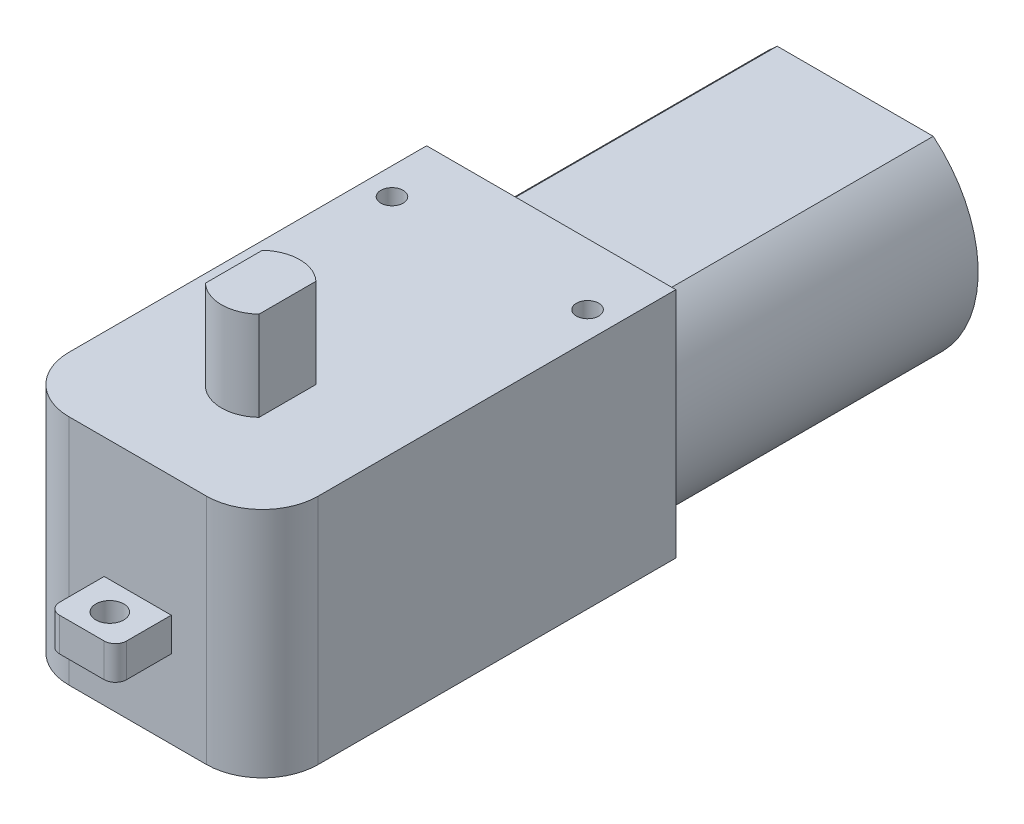
ISO-10303-21;
HEADER;
FILE_DESCRIPTION(('STEP AP214'),'2;1');
FILE_NAME('part.step','',(''),(''),'','','');
FILE_SCHEMA(('AUTOMOTIVE_DESIGN { 1 0 10303 214 1 1 1 1 }'));
ENDSEC;
DATA;
#1=APPLICATION_CONTEXT('core data for automotive mechanical design processes');
#2=APPLICATION_PROTOCOL_DEFINITION('international standard','automotive_design',2000,#1);
#3=PRODUCT_CONTEXT('',#1,'mechanical');
#4=PRODUCT('Part','Part','',(#3));
#5=PRODUCT_RELATED_PRODUCT_CATEGORY('part','',(#4));
#6=PRODUCT_DEFINITION_FORMATION('','',#4);
#7=PRODUCT_DEFINITION_CONTEXT('part definition',#1,'design');
#8=PRODUCT_DEFINITION('design','',#6,#7);
#9=PRODUCT_DEFINITION_SHAPE('','',#8);
#10=(LENGTH_UNIT() NAMED_UNIT(*) SI_UNIT(.MILLI.,.METRE.));
#11=(NAMED_UNIT(*) PLANE_ANGLE_UNIT() SI_UNIT($,.RADIAN.));
#12=(NAMED_UNIT(*) SI_UNIT($,.STERADIAN.) SOLID_ANGLE_UNIT());
#13=UNCERTAINTY_MEASURE_WITH_UNIT(LENGTH_MEASURE(1.E-05),#10,'distance_accuracy_value','');
#14=(GEOMETRIC_REPRESENTATION_CONTEXT(3) GLOBAL_UNCERTAINTY_ASSIGNED_CONTEXT((#13)) GLOBAL_UNIT_ASSIGNED_CONTEXT((#10,
#11,#12)) REPRESENTATION_CONTEXT('',''));
#15=CARTESIAN_POINT('',(0.,0.,0.));
#16=DIRECTION('',(0.,0.,1.));
#17=DIRECTION('',(1.,0.,0.));
#18=AXIS2_PLACEMENT_3D('',#15,#16,#17);
#19=CARTESIAN_POINT('',(0.,0.,0.));
#20=DIRECTION('',(0.,-1.,0.));
#21=DIRECTION('',(0.,0.,-1.));
#22=AXIS2_PLACEMENT_3D('',#19,#20,#21);
#23=PLANE('',#22);
#24=CARTESIAN_POINT('',(8.75,0.,-31.5));
#25=DIRECTION('',(0.,-1.,0.));
#26=DIRECTION('',(0.,0.,-1.));
#27=AXIS2_PLACEMENT_3D('',#24,#25,#26);
#28=CIRCLE('',#27,0.999999999999996);
#29=CARTESIAN_POINT('',(8.75,0.,-32.5));
#30=VERTEX_POINT('',#29);
#31=EDGE_CURVE('E280',#30,#30,#28,.T.);
#32=ORIENTED_EDGE('',*,*,#31,.F.);
#33=EDGE_LOOP('',(#32));
#34=FACE_BOUND('',#33,.T.);
#35=CARTESIAN_POINT('',(-8.75,0.,-31.5));
#36=DIRECTION('',(0.,-1.,0.));
#37=DIRECTION('',(0.,0.,-1.));
#38=AXIS2_PLACEMENT_3D('',#35,#36,#37);
#39=CIRCLE('',#38,0.999999999999996);
#40=CARTESIAN_POINT('',(-8.75,0.,-32.5));
#41=VERTEX_POINT('',#40);
#42=EDGE_CURVE('E220',#41,#41,#39,.T.);
#43=ORIENTED_EDGE('',*,*,#42,.F.);
#44=EDGE_LOOP('',(#43));
#45=FACE_BOUND('',#44,.T.);
#46=DIRECTION('',(0.,0.,-1.));
#47=VECTOR('',#46,1.);
#48=CARTESIAN_POINT('',(-3.99999999999999,0.,-41.));
#49=LINE('',#48,#47);
#50=CARTESIAN_POINT('',(-3.99999999999999,0.,-41.));
#51=VERTEX_POINT('',#50);
#52=CARTESIAN_POINT('',(-3.99999999999999,0.,-64.2));
#53=VERTEX_POINT('',#52);
#54=EDGE_CURVE('E37',#51,#53,#49,.T.);
#55=ORIENTED_EDGE('',*,*,#54,.F.);
#56=DIRECTION('',(-1.,0.,0.));
#57=VECTOR('',#56,1.);
#58=CARTESIAN_POINT('',(-3.99999999999999,0.,-41.));
#59=LINE('',#58,#57);
#60=CARTESIAN_POINT('',(4.00000000000001,0.,-41.));
#61=VERTEX_POINT('',#60);
#62=EDGE_CURVE('E214',#61,#51,#59,.T.);
#63=ORIENTED_EDGE('',*,*,#62,.F.);
#64=DIRECTION('',(0.,0.,1.));
#65=VECTOR('',#64,1.);
#66=CARTESIAN_POINT('',(4.00000000000001,0.,-41.));
#67=LINE('',#66,#65);
#68=CARTESIAN_POINT('',(4.00000000000001,0.,-64.2));
#69=VERTEX_POINT('',#68);
#70=EDGE_CURVE('E230',#69,#61,#67,.T.);
#71=ORIENTED_EDGE('',*,*,#70,.F.);
#72=DIRECTION('',(-1.,0.,0.));
#73=VECTOR('',#72,1.);
#74=CARTESIAN_POINT('',(6.98212002188447,0.,-64.2));
#75=LINE('',#74,#73);
#76=CARTESIAN_POINT('',(6.98212002188447,0.,-64.2));
#77=VERTEX_POINT('',#76);
#78=EDGE_CURVE('E235',#77,#69,#75,.T.);
#79=ORIENTED_EDGE('',*,*,#78,.F.);
#80=DIRECTION('',(0.,0.,1.));
#81=VECTOR('',#80,1.);
#82=CARTESIAN_POINT('',(6.98212002188447,0.,-64.2));
#83=LINE('',#82,#81);
#84=CARTESIAN_POINT('',(6.98212002188447,0.,-37.));
#85=VERTEX_POINT('',#84);
#86=EDGE_CURVE('E428',#77,#85,#83,.T.);
#87=ORIENTED_EDGE('',*,*,#86,.T.);
#88=DIRECTION('',(-1.,0.,0.));
#89=VECTOR('',#88,1.);
#90=CARTESIAN_POINT('',(-11.15,0.,-37.));
#91=LINE('',#90,#89);
#92=CARTESIAN_POINT('',(11.15,0.,-37.));
#93=VERTEX_POINT('',#92);
#94=EDGE_CURVE('E373',#93,#85,#91,.T.);
#95=ORIENTED_EDGE('',*,*,#94,.F.);
#96=DIRECTION('',(0.,0.,-1.));
#97=VECTOR('',#96,1.);
#98=CARTESIAN_POINT('',(11.15,0.,0.));
#99=LINE('',#98,#97);
#100=CARTESIAN_POINT('',(11.15,0.,-5.));
#101=VERTEX_POINT('',#100);
#102=EDGE_CURVE('E382',#101,#93,#99,.T.);
#103=ORIENTED_EDGE('',*,*,#102,.F.);
#104=CARTESIAN_POINT('',(6.15,0.,-5.));
#105=DIRECTION('',(0.,-1.,0.));
#106=DIRECTION('',(0.,0.,-1.));
#107=AXIS2_PLACEMENT_3D('',#104,#105,#106);
#108=CIRCLE('',#107,5.);
#109=CARTESIAN_POINT('',(6.15,0.,0.));
#110=VERTEX_POINT('',#109);
#111=EDGE_CURVE('E397',#101,#110,#108,.T.);
#112=ORIENTED_EDGE('',*,*,#111,.T.);
#113=DIRECTION('',(1.,0.,0.));
#114=VECTOR('',#113,1.);
#115=CARTESIAN_POINT('',(-11.15,0.,0.));
#116=LINE('',#115,#114);
#117=CARTESIAN_POINT('',(-6.15,0.,0.));
#118=VERTEX_POINT('',#117);
#119=EDGE_CURVE('E425',#118,#110,#116,.T.);
#120=ORIENTED_EDGE('',*,*,#119,.F.);
#121=CARTESIAN_POINT('',(-6.15,0.,-5.));
#122=DIRECTION('',(0.,-1.,0.));
#123=DIRECTION('',(0.,0.,-1.));
#124=AXIS2_PLACEMENT_3D('',#121,#122,#123);
#125=CIRCLE('',#124,5.);
#126=CARTESIAN_POINT('',(-11.15,0.,-5.));
#127=VERTEX_POINT('',#126);
#128=EDGE_CURVE('E395',#118,#127,#125,.T.);
#129=ORIENTED_EDGE('',*,*,#128,.T.);
#130=DIRECTION('',(0.,0.,1.));
#131=VECTOR('',#130,1.);
#132=CARTESIAN_POINT('',(-11.15,0.,0.));
#133=LINE('',#132,#131);
#134=CARTESIAN_POINT('',(-11.15,0.,-37.));
#135=VERTEX_POINT('',#134);
#136=EDGE_CURVE('E424',#135,#127,#133,.T.);
#137=ORIENTED_EDGE('',*,*,#136,.F.);
#138=CARTESIAN_POINT('',(-6.98212002188447,0.,-37.));
#139=VERTEX_POINT('',#138);
#140=EDGE_CURVE('E377',#139,#135,#91,.T.);
#141=ORIENTED_EDGE('',*,*,#140,.F.);
#142=DIRECTION('',(0.,0.,1.));
#143=VECTOR('',#142,1.);
#144=CARTESIAN_POINT('',(-6.98212002188447,0.,-64.2));
#145=LINE('',#144,#143);
#146=CARTESIAN_POINT('',(-6.98212002188447,0.,-64.2));
#147=VERTEX_POINT('',#146);
#148=EDGE_CURVE('E431',#147,#139,#145,.T.);
#149=ORIENTED_EDGE('',*,*,#148,.F.);
#150=EDGE_CURVE('E55',#53,#147,#75,.T.);
#151=ORIENTED_EDGE('',*,*,#150,.F.);
#152=EDGE_LOOP('',(#55,#63,#71,#79,#87,#95,#103,#112,#120,#129,#137,#141,#149,#151));
#153=FACE_BOUND('',#152,.T.);
#154=CARTESIAN_POINT('',(0.,0.,-11.));
#155=DIRECTION('',(0.,-1.,0.));
#156=DIRECTION('',(0.,0.,-1.));
#157=AXIS2_PLACEMENT_3D('',#154,#155,#156);
#158=CIRCLE('',#157,4.5);
#159=CARTESIAN_POINT('',(0.,0.,-15.5));
#160=VERTEX_POINT('',#159);
#161=EDGE_CURVE('E750',#160,#160,#158,.T.);
#162=ORIENTED_EDGE('',*,*,#161,.F.);
#163=EDGE_LOOP('',(#162));
#164=FACE_BOUND('',#163,.T.);
#165=ADVANCED_FACE('F33',(#34,#45,#153,#164),#23,.T.);
#166=CARTESIAN_POINT('',(-11.15,20.8,0.));
#167=DIRECTION('',(0.,0.,-1.));
#168=DIRECTION('',(-1.,0.,0.));
#169=AXIS2_PLACEMENT_3D('',#166,#167,#168);
#170=PLANE('',#169);
#171=ORIENTED_EDGE('',*,*,#119,.T.);
#172=DIRECTION('',(0.,-1.,0.));
#173=VECTOR('',#172,1.);
#174=CARTESIAN_POINT('',(6.15,20.8,0.));
#175=LINE('',#174,#173);
#176=CARTESIAN_POINT('',(6.15,20.8,0.));
#177=VERTEX_POINT('',#176);
#178=EDGE_CURVE('E402',#110,#177,#175,.F.);
#179=ORIENTED_EDGE('',*,*,#178,.T.);
#180=DIRECTION('',(1.,0.,0.));
#181=VECTOR('',#180,1.);
#182=CARTESIAN_POINT('',(-11.15,20.8,0.));
#183=LINE('',#182,#181);
#184=CARTESIAN_POINT('',(-6.15,20.8,0.));
#185=VERTEX_POINT('',#184);
#186=EDGE_CURVE('E408',#185,#177,#183,.T.);
#187=ORIENTED_EDGE('',*,*,#186,.F.);
#188=DIRECTION('',(0.,-1.,0.));
#189=VECTOR('',#188,1.);
#190=CARTESIAN_POINT('',(-6.15,20.8,0.));
#191=LINE('',#190,#189);
#192=EDGE_CURVE('E399',#185,#118,#191,.T.);
#193=ORIENTED_EDGE('',*,*,#192,.T.);
#194=EDGE_LOOP('',(#171,#179,#187,#193));
#195=FACE_BOUND('',#194,.T.);
#196=DIRECTION('',(0.,1.,0.));
#197=VECTOR('',#196,1.);
#198=CARTESIAN_POINT('',(3.,10.,0.));
#199=LINE('',#198,#197);
#200=CARTESIAN_POINT('',(3.,7.,0.));
#201=VERTEX_POINT('',#200);
#202=CARTESIAN_POINT('',(3.,10.,0.));
#203=VERTEX_POINT('',#202);
#204=EDGE_CURVE('E298',#201,#203,#199,.T.);
#205=ORIENTED_EDGE('',*,*,#204,.F.);
#206=DIRECTION('',(1.,0.,0.));
#207=VECTOR('',#206,1.);
#208=CARTESIAN_POINT('',(-3.,7.,0.));
#209=LINE('',#208,#207);
#210=CARTESIAN_POINT('',(-3.,7.,0.));
#211=VERTEX_POINT('',#210);
#212=EDGE_CURVE('E303',#211,#201,#209,.T.);
#213=ORIENTED_EDGE('',*,*,#212,.F.);
#214=DIRECTION('',(0.,-1.,0.));
#215=VECTOR('',#214,1.);
#216=CARTESIAN_POINT('',(-3.,10.,0.));
#217=LINE('',#216,#215);
#218=CARTESIAN_POINT('',(-3.,10.,0.));
#219=VERTEX_POINT('',#218);
#220=EDGE_CURVE('E312',#219,#211,#217,.T.);
#221=ORIENTED_EDGE('',*,*,#220,.F.);
#222=DIRECTION('',(-1.,0.,0.));
#223=VECTOR('',#222,1.);
#224=CARTESIAN_POINT('',(-3.,10.,0.));
#225=LINE('',#224,#223);
#226=EDGE_CURVE('E309',#203,#219,#225,.T.);
#227=ORIENTED_EDGE('',*,*,#226,.F.);
#228=EDGE_LOOP('',(#205,#213,#221,#227));
#229=FACE_BOUND('',#228,.T.);
#230=ADVANCED_FACE('F414',(#195,#229),#170,.F.);
#231=CARTESIAN_POINT('',(0.,28.8,-11.));
#232=DIRECTION('',(0.,-1.,0.));
#233=DIRECTION('',(0.,0.,-1.));
#234=AXIS2_PLACEMENT_3D('',#231,#232,#233);
#235=CYLINDRICAL_SURFACE('',#234,3.5);
#236=CARTESIAN_POINT('',(0.,28.8,-11.));
#237=DIRECTION('',(0.,1.,0.));
#238=DIRECTION('',(0.,0.,1.));
#239=AXIS2_PLACEMENT_3D('',#236,#237,#238);
#240=CIRCLE('',#239,3.5);
#241=CARTESIAN_POINT('',(2.4,28.8,-13.5475478405714));
#242=VERTEX_POINT('',#241);
#243=CARTESIAN_POINT('',(-2.4,28.8,-13.5475478405714));
#244=VERTEX_POINT('',#243);
#245=EDGE_CURVE('E344',#242,#244,#240,.T.);
#246=ORIENTED_EDGE('',*,*,#245,.F.);
#247=DIRECTION('',(0.,1.,0.));
#248=VECTOR('',#247,1.);
#249=CARTESIAN_POINT('',(2.4,15.5875149880311,-13.5475478405714));
#250=LINE('',#249,#248);
#251=CARTESIAN_POINT('',(2.4,20.8,-13.5475478405714));
#252=VERTEX_POINT('',#251);
#253=EDGE_CURVE('E332',#252,#242,#250,.T.);
#254=ORIENTED_EDGE('',*,*,#253,.F.);
#255=CARTESIAN_POINT('',(0.,20.8,-11.));
#256=DIRECTION('',(0.,-1.,0.));
#257=DIRECTION('',(0.,0.,-1.));
#258=AXIS2_PLACEMENT_3D('',#255,#256,#257);
#259=CIRCLE('',#258,3.5);
#260=CARTESIAN_POINT('',(-2.4,20.8,-13.5475478405714));
#261=VERTEX_POINT('',#260);
#262=EDGE_CURVE('E265',#252,#261,#259,.F.);
#263=ORIENTED_EDGE('',*,*,#262,.T.);
#264=DIRECTION('',(0.,1.,0.));
#265=VECTOR('',#264,1.);
#266=CARTESIAN_POINT('',(-2.4,15.5875149880311,-13.5475478405714));
#267=LINE('',#266,#265);
#268=EDGE_CURVE('E340',#261,#244,#267,.T.);
#269=ORIENTED_EDGE('',*,*,#268,.T.);
#270=EDGE_LOOP('',(#246,#254,#263,#269));
#271=FACE_BOUND('',#270,.T.);
#272=ADVANCED_FACE('F358',(#271),#235,.T.);
#273=CARTESIAN_POINT('',(0.,20.8,0.));
#274=DIRECTION('',(0.,-1.,0.));
#275=DIRECTION('',(0.,0.,-1.));
#276=AXIS2_PLACEMENT_3D('',#273,#274,#275);
#277=PLANE('',#276);
#278=CARTESIAN_POINT('',(-8.75,20.8,-31.5));
#279=DIRECTION('',(0.,1.,0.));
#280=DIRECTION('',(0.,0.,1.));
#281=AXIS2_PLACEMENT_3D('',#278,#279,#280);
#282=CIRCLE('',#281,0.999999999999997);
#283=CARTESIAN_POINT('',(-8.75,20.8,-30.5));
#284=VERTEX_POINT('',#283);
#285=EDGE_CURVE('E217',#284,#284,#282,.T.);
#286=ORIENTED_EDGE('',*,*,#285,.F.);
#287=EDGE_LOOP('',(#286));
#288=FACE_BOUND('',#287,.T.);
#289=CARTESIAN_POINT('',(8.75,20.8,-31.5));
#290=DIRECTION('',(0.,1.,0.));
#291=DIRECTION('',(0.,0.,1.));
#292=AXIS2_PLACEMENT_3D('',#289,#290,#291);
#293=CIRCLE('',#292,0.999999999999997);
#294=CARTESIAN_POINT('',(8.75,20.8,-30.5));
#295=VERTEX_POINT('',#294);
#296=EDGE_CURVE('E283',#295,#295,#293,.T.);
#297=ORIENTED_EDGE('',*,*,#296,.F.);
#298=EDGE_LOOP('',(#297));
#299=FACE_BOUND('',#298,.T.);
#300=ORIENTED_EDGE('',*,*,#186,.T.);
#301=CARTESIAN_POINT('',(6.15,20.8,-5.));
#302=DIRECTION('',(0.,-1.,0.));
#303=DIRECTION('',(0.,0.,-1.));
#304=AXIS2_PLACEMENT_3D('',#301,#302,#303);
#305=CIRCLE('',#304,5.);
#306=CARTESIAN_POINT('',(11.15,20.8,-5.));
#307=VERTEX_POINT('',#306);
#308=EDGE_CURVE('E362',#177,#307,#305,.F.);
#309=ORIENTED_EDGE('',*,*,#308,.T.);
#310=DIRECTION('',(0.,0.,-1.));
#311=VECTOR('',#310,1.);
#312=CARTESIAN_POINT('',(11.15,20.8,0.));
#313=LINE('',#312,#311);
#314=CARTESIAN_POINT('',(11.15,20.8,-37.));
#315=VERTEX_POINT('',#314);
#316=EDGE_CURVE('E418',#307,#315,#313,.T.);
#317=ORIENTED_EDGE('',*,*,#316,.T.);
#318=DIRECTION('',(-1.,0.,0.));
#319=VECTOR('',#318,1.);
#320=CARTESIAN_POINT('',(-11.15,20.8,-37.));
#321=LINE('',#320,#319);
#322=CARTESIAN_POINT('',(-11.15,20.8,-37.));
#323=VERTEX_POINT('',#322);
#324=EDGE_CURVE('E389',#315,#323,#321,.T.);
#325=ORIENTED_EDGE('',*,*,#324,.T.);
#326=DIRECTION('',(0.,0.,1.));
#327=VECTOR('',#326,1.);
#328=CARTESIAN_POINT('',(-11.15,20.8,0.));
#329=LINE('',#328,#327);
#330=CARTESIAN_POINT('',(-11.15,20.8,-5.));
#331=VERTEX_POINT('',#330);
#332=EDGE_CURVE('E376',#323,#331,#329,.T.);
#333=ORIENTED_EDGE('',*,*,#332,.T.);
#334=CARTESIAN_POINT('',(-6.15,20.8,-5.));
#335=DIRECTION('',(0.,-1.,0.));
#336=DIRECTION('',(0.,0.,-1.));
#337=AXIS2_PLACEMENT_3D('',#334,#335,#336);
#338=CIRCLE('',#337,5.);
#339=EDGE_CURVE('E369',#331,#185,#338,.F.);
#340=ORIENTED_EDGE('',*,*,#339,.T.);
#341=EDGE_LOOP('',(#300,#309,#317,#325,#333,#340));
#342=FACE_BOUND('',#341,.T.);
#343=CARTESIAN_POINT('',(-2.4,20.8,-8.4524521594286));
#344=VERTEX_POINT('',#343);
#345=CARTESIAN_POINT('',(2.4,20.8,-8.4524521594286));
#346=VERTEX_POINT('',#345);
#347=EDGE_CURVE('E261',#344,#346,#259,.F.);
#348=ORIENTED_EDGE('',*,*,#347,.F.);
#349=DIRECTION('',(0.,0.,-1.));
#350=VECTOR('',#349,1.);
#351=CARTESIAN_POINT('',(-2.4,20.8,-13.5475478405714));
#352=LINE('',#351,#350);
#353=EDGE_CURVE('E337',#344,#261,#352,.T.);
#354=ORIENTED_EDGE('',*,*,#353,.T.);
#355=ORIENTED_EDGE('',*,*,#262,.F.);
#356=DIRECTION('',(0.,0.,1.));
#357=VECTOR('',#356,1.);
#358=CARTESIAN_POINT('',(2.4,20.8,-13.5475478405714));
#359=LINE('',#358,#357);
#360=EDGE_CURVE('E326',#252,#346,#359,.T.);
#361=ORIENTED_EDGE('',*,*,#360,.T.);
#362=EDGE_LOOP('',(#348,#354,#355,#361));
#363=FACE_BOUND('',#362,.T.);
#364=ADVANCED_FACE('F407',(#288,#299,#342,#363),#277,.F.);
#365=CARTESIAN_POINT('',(-11.15,20.8,-37.));
#366=DIRECTION('',(0.,0.,1.));
#367=DIRECTION('',(1.,0.,0.));
#368=AXIS2_PLACEMENT_3D('',#365,#366,#367);
#369=PLANE('',#368);
#370=CARTESIAN_POINT('',(0.,8.5,-37.));
#371=DIRECTION('',(0.,0.,-1.));
#372=DIRECTION('',(1.,0.,0.));
#373=AXIS2_PLACEMENT_3D('',#370,#371,#372);
#374=CIRCLE('',#373,11.);
#375=CARTESIAN_POINT('',(6.98212002188447,17.,-37.));
#376=VERTEX_POINT('',#375);
#377=EDGE_CURVE('E253',#376,#85,#374,.T.);
#378=ORIENTED_EDGE('',*,*,#377,.F.);
#379=DIRECTION('',(1.,0.,0.));
#380=VECTOR('',#379,1.);
#381=CARTESIAN_POINT('',(6.98212002188447,17.,-37.));
#382=LINE('',#381,#380);
#383=CARTESIAN_POINT('',(-6.98212002188447,17.,-37.));
#384=VERTEX_POINT('',#383);
#385=EDGE_CURVE('E250',#384,#376,#382,.T.);
#386=ORIENTED_EDGE('',*,*,#385,.F.);
#387=CARTESIAN_POINT('',(0.,8.5,-37.));
#388=DIRECTION('',(0.,0.,-1.));
#389=DIRECTION('',(-1.,0.,0.));
#390=AXIS2_PLACEMENT_3D('',#387,#388,#389);
#391=CIRCLE('',#390,11.);
#392=EDGE_CURVE('E257',#139,#384,#391,.T.);
#393=ORIENTED_EDGE('',*,*,#392,.F.);
#394=ORIENTED_EDGE('',*,*,#140,.T.);
#395=DIRECTION('',(0.,-1.,0.));
#396=VECTOR('',#395,1.);
#397=CARTESIAN_POINT('',(-11.15,20.8,-37.));
#398=LINE('',#397,#396);
#399=EDGE_CURVE('E384',#323,#135,#398,.T.);
#400=ORIENTED_EDGE('',*,*,#399,.F.);
#401=ORIENTED_EDGE('',*,*,#324,.F.);
#402=DIRECTION('',(0.,-1.,0.));
#403=VECTOR('',#402,1.);
#404=CARTESIAN_POINT('',(11.15,20.8,-37.));
#405=LINE('',#404,#403);
#406=EDGE_CURVE('E388',#315,#93,#405,.T.);
#407=ORIENTED_EDGE('',*,*,#406,.T.);
#408=ORIENTED_EDGE('',*,*,#94,.T.);
#409=EDGE_LOOP('',(#378,#386,#393,#394,#400,#401,#407,#408));
#410=FACE_BOUND('',#409,.T.);
#411=ADVANCED_FACE('F468',(#410),#369,.F.);
#412=CARTESIAN_POINT('',(-11.15,20.8,0.));
#413=DIRECTION('',(1.,0.,0.));
#414=DIRECTION('',(0.,0.,-1.));
#415=AXIS2_PLACEMENT_3D('',#412,#413,#414);
#416=PLANE('',#415);
#417=ORIENTED_EDGE('',*,*,#136,.T.);
#418=DIRECTION('',(0.,-1.,0.));
#419=VECTOR('',#418,1.);
#420=CARTESIAN_POINT('',(-11.15,20.8,-5.));
#421=LINE('',#420,#419);
#422=EDGE_CURVE('E361',#127,#331,#421,.F.);
#423=ORIENTED_EDGE('',*,*,#422,.T.);
#424=ORIENTED_EDGE('',*,*,#332,.F.);
#425=ORIENTED_EDGE('',*,*,#399,.T.);
#426=EDGE_LOOP('',(#417,#423,#424,#425));
#427=FACE_BOUND('',#426,.T.);
#428=ADVANCED_FACE('F426',(#427),#416,.F.);
#429=CARTESIAN_POINT('',(11.15,20.8,0.));
#430=DIRECTION('',(-1.,0.,0.));
#431=DIRECTION('',(0.,0.,1.));
#432=AXIS2_PLACEMENT_3D('',#429,#430,#431);
#433=PLANE('',#432);
#434=ORIENTED_EDGE('',*,*,#316,.F.);
#435=DIRECTION('',(0.,-1.,0.));
#436=VECTOR('',#435,1.);
#437=CARTESIAN_POINT('',(11.15,20.8,-5.));
#438=LINE('',#437,#436);
#439=EDGE_CURVE('E392',#307,#101,#438,.T.);
#440=ORIENTED_EDGE('',*,*,#439,.T.);
#441=ORIENTED_EDGE('',*,*,#102,.T.);
#442=ORIENTED_EDGE('',*,*,#406,.F.);
#443=EDGE_LOOP('',(#434,#440,#441,#442));
#444=FACE_BOUND('',#443,.T.);
#445=ADVANCED_FACE('F464',(#444),#433,.F.);
#446=CARTESIAN_POINT('',(6.15,20.8,-5.));
#447=DIRECTION('',(0.,-1.,0.));
#448=DIRECTION('',(0.,0.,-1.));
#449=AXIS2_PLACEMENT_3D('',#446,#447,#448);
#450=CYLINDRICAL_SURFACE('',#449,5.);
#451=ORIENTED_EDGE('',*,*,#308,.F.);
#452=ORIENTED_EDGE('',*,*,#178,.F.);
#453=ORIENTED_EDGE('',*,*,#111,.F.);
#454=ORIENTED_EDGE('',*,*,#439,.F.);
#455=EDGE_LOOP('',(#451,#452,#453,#454));
#456=FACE_BOUND('',#455,.T.);
#457=ADVANCED_FACE('F505',(#456),#450,.T.);
#458=CARTESIAN_POINT('',(-6.15,20.8,-5.));
#459=DIRECTION('',(0.,-1.,0.));
#460=DIRECTION('',(0.,0.,-1.));
#461=AXIS2_PLACEMENT_3D('',#458,#459,#460);
#462=CYLINDRICAL_SURFACE('',#461,5.);
#463=ORIENTED_EDGE('',*,*,#339,.F.);
#464=ORIENTED_EDGE('',*,*,#422,.F.);
#465=ORIENTED_EDGE('',*,*,#128,.F.);
#466=ORIENTED_EDGE('',*,*,#192,.F.);
#467=EDGE_LOOP('',(#463,#464,#465,#466));
#468=FACE_BOUND('',#467,.T.);
#469=ADVANCED_FACE('F420',(#468),#462,.T.);
#470=CARTESIAN_POINT('',(0.,8.5,-64.2));
#471=DIRECTION('',(0.,0.,1.));
#472=DIRECTION('',(1.,0.,0.));
#473=AXIS2_PLACEMENT_3D('',#470,#471,#472);
#474=CYLINDRICAL_SURFACE('',#473,11.);
#475=ORIENTED_EDGE('',*,*,#377,.T.);
#476=ORIENTED_EDGE('',*,*,#86,.F.);
#477=CARTESIAN_POINT('',(0.,8.5,-64.2));
#478=DIRECTION('',(0.,0.,-1.));
#479=DIRECTION('',(1.,0.,0.));
#480=AXIS2_PLACEMENT_3D('',#477,#478,#479);
#481=CIRCLE('',#480,11.);
#482=CARTESIAN_POINT('',(6.98212002188447,17.,-64.2));
#483=VERTEX_POINT('',#482);
#484=EDGE_CURVE('E236',#483,#77,#481,.T.);
#485=ORIENTED_EDGE('',*,*,#484,.F.);
#486=DIRECTION('',(0.,0.,1.));
#487=VECTOR('',#486,1.);
#488=CARTESIAN_POINT('',(6.98212002188447,17.,-64.2));
#489=LINE('',#488,#487);
#490=EDGE_CURVE('E247',#483,#376,#489,.T.);
#491=ORIENTED_EDGE('',*,*,#490,.T.);
#492=EDGE_LOOP('',(#475,#476,#485,#491));
#493=FACE_BOUND('',#492,.T.);
#494=ADVANCED_FACE('F442',(#493),#474,.T.);
#495=CARTESIAN_POINT('',(0.,8.5,-64.2));
#496=DIRECTION('',(0.,0.,1.));
#497=DIRECTION('',(1.,0.,0.));
#498=AXIS2_PLACEMENT_3D('',#495,#496,#497);
#499=CYLINDRICAL_SURFACE('',#498,11.);
#500=ORIENTED_EDGE('',*,*,#392,.T.);
#501=DIRECTION('',(0.,0.,1.));
#502=VECTOR('',#501,1.);
#503=CARTESIAN_POINT('',(-6.98212002188447,17.,-64.2));
#504=LINE('',#503,#502);
#505=CARTESIAN_POINT('',(-6.98212002188447,17.,-64.2));
#506=VERTEX_POINT('',#505);
#507=EDGE_CURVE('E436',#506,#384,#504,.T.);
#508=ORIENTED_EDGE('',*,*,#507,.F.);
#509=CARTESIAN_POINT('',(0.,8.5,-64.2));
#510=DIRECTION('',(0.,0.,-1.));
#511=DIRECTION('',(-1.,0.,0.));
#512=AXIS2_PLACEMENT_3D('',#509,#510,#511);
#513=CIRCLE('',#512,11.);
#514=EDGE_CURVE('E242',#147,#506,#513,.T.);
#515=ORIENTED_EDGE('',*,*,#514,.F.);
#516=ORIENTED_EDGE('',*,*,#148,.T.);
#517=EDGE_LOOP('',(#500,#508,#515,#516));
#518=FACE_BOUND('',#517,.T.);
#519=ADVANCED_FACE('F459',(#518),#499,.T.);
#520=CARTESIAN_POINT('',(6.98212002188447,17.,-64.2));
#521=DIRECTION('',(0.,-1.,0.));
#522=DIRECTION('',(0.,0.,-1.));
#523=AXIS2_PLACEMENT_3D('',#520,#521,#522);
#524=PLANE('',#523);
#525=ORIENTED_EDGE('',*,*,#385,.T.);
#526=ORIENTED_EDGE('',*,*,#490,.F.);
#527=DIRECTION('',(1.,0.,0.));
#528=VECTOR('',#527,1.);
#529=CARTESIAN_POINT('',(6.98212002188447,17.,-64.2));
#530=LINE('',#529,#528);
#531=EDGE_CURVE('E245',#506,#483,#530,.T.);
#532=ORIENTED_EDGE('',*,*,#531,.F.);
#533=ORIENTED_EDGE('',*,*,#507,.T.);
#534=EDGE_LOOP('',(#525,#526,#532,#533));
#535=FACE_BOUND('',#534,.T.);
#536=ADVANCED_FACE('F447',(#535),#524,.F.);
#537=CARTESIAN_POINT('',(0.,8.5,-64.2));
#538=DIRECTION('',(0.,0.,1.));
#539=DIRECTION('',(1.,0.,0.));
#540=AXIS2_PLACEMENT_3D('',#537,#538,#539);
#541=PLANE('',#540);
#542=ORIENTED_EDGE('',*,*,#484,.T.);
#543=ORIENTED_EDGE('',*,*,#78,.T.);
#544=DIRECTION('',(0.,1.,0.));
#545=VECTOR('',#544,1.);
#546=CARTESIAN_POINT('',(4.00000000000001,-2.5,-64.2));
#547=LINE('',#546,#545);
#548=CARTESIAN_POINT('',(4.00000000000001,-2.5,-64.2));
#549=VERTEX_POINT('',#548);
#550=EDGE_CURVE('E201',#549,#69,#547,.T.);
#551=ORIENTED_EDGE('',*,*,#550,.F.);
#552=DIRECTION('',(1.,0.,0.));
#553=VECTOR('',#552,1.);
#554=CARTESIAN_POINT('',(-3.99999999999999,-2.5,-64.2));
#555=LINE('',#554,#553);
#556=CARTESIAN_POINT('',(-3.99999999999999,-2.5,-64.2));
#557=VERTEX_POINT('',#556);
#558=EDGE_CURVE('E193',#557,#549,#555,.T.);
#559=ORIENTED_EDGE('',*,*,#558,.F.);
#560=DIRECTION('',(0.,1.,0.));
#561=VECTOR('',#560,1.);
#562=CARTESIAN_POINT('',(-3.99999999999999,-2.5,-64.2));
#563=LINE('',#562,#561);
#564=EDGE_CURVE('E198',#557,#53,#563,.T.);
#565=ORIENTED_EDGE('',*,*,#564,.T.);
#566=ORIENTED_EDGE('',*,*,#150,.T.);
#567=ORIENTED_EDGE('',*,*,#514,.T.);
#568=ORIENTED_EDGE('',*,*,#531,.T.);
#569=EDGE_LOOP('',(#542,#543,#551,#559,#565,#566,#567,#568));
#570=FACE_BOUND('',#569,.T.);
#571=ADVANCED_FACE('F196',(#570),#541,.F.);
#572=ORIENTED_EDGE('',*,*,#347,.T.);
#573=DIRECTION('',(0.,1.,0.));
#574=VECTOR('',#573,1.);
#575=CARTESIAN_POINT('',(2.4,15.5875149880311,-8.4524521594286));
#576=LINE('',#575,#574);
#577=CARTESIAN_POINT('',(2.4,28.8,-8.4524521594286));
#578=VERTEX_POINT('',#577);
#579=EDGE_CURVE('E329',#346,#578,#576,.T.);
#580=ORIENTED_EDGE('',*,*,#579,.T.);
#581=CARTESIAN_POINT('',(-2.4,28.8,-8.4524521594286));
#582=VERTEX_POINT('',#581);
#583=EDGE_CURVE('E258',#582,#578,#240,.T.);
#584=ORIENTED_EDGE('',*,*,#583,.F.);
#585=DIRECTION('',(0.,1.,0.));
#586=VECTOR('',#585,1.);
#587=CARTESIAN_POINT('',(-2.4,15.5875149880311,-8.4524521594286));
#588=LINE('',#587,#586);
#589=EDGE_CURVE('E343',#344,#582,#588,.T.);
#590=ORIENTED_EDGE('',*,*,#589,.F.);
#591=EDGE_LOOP('',(#572,#580,#584,#590));
#592=FACE_BOUND('',#591,.T.);
#593=ADVANCED_FACE('F568',(#592),#235,.T.);
#594=CARTESIAN_POINT('',(0.,28.8,-11.));
#595=DIRECTION('',(0.,1.,0.));
#596=DIRECTION('',(0.,0.,1.));
#597=AXIS2_PLACEMENT_3D('',#594,#595,#596);
#598=PLANE('',#597);
#599=DIRECTION('',(0.,0.,1.));
#600=VECTOR('',#599,1.);
#601=CARTESIAN_POINT('',(2.4,28.8,-13.5475478405714));
#602=LINE('',#601,#600);
#603=EDGE_CURVE('E324',#242,#578,#602,.T.);
#604=ORIENTED_EDGE('',*,*,#603,.F.);
#605=ORIENTED_EDGE('',*,*,#245,.T.);
#606=DIRECTION('',(0.,0.,-1.));
#607=VECTOR('',#606,1.);
#608=CARTESIAN_POINT('',(-2.4,28.8,-13.5475478405714));
#609=LINE('',#608,#607);
#610=EDGE_CURVE('E334',#582,#244,#609,.T.);
#611=ORIENTED_EDGE('',*,*,#610,.F.);
#612=ORIENTED_EDGE('',*,*,#583,.T.);
#613=EDGE_LOOP('',(#604,#605,#611,#612));
#614=FACE_BOUND('',#613,.T.);
#615=ADVANCED_FACE('F351',(#614),#598,.T.);
#616=CARTESIAN_POINT('',(-2.4,15.5875149880311,-13.5475478405714));
#617=DIRECTION('',(1.,0.,0.));
#618=DIRECTION('',(0.,0.,-1.));
#619=AXIS2_PLACEMENT_3D('',#616,#617,#618);
#620=PLANE('',#619);
#621=ORIENTED_EDGE('',*,*,#589,.T.);
#622=ORIENTED_EDGE('',*,*,#610,.T.);
#623=ORIENTED_EDGE('',*,*,#268,.F.);
#624=ORIENTED_EDGE('',*,*,#353,.F.);
#625=EDGE_LOOP('',(#621,#622,#623,#624));
#626=FACE_BOUND('',#625,.T.);
#627=ADVANCED_FACE('F356',(#626),#620,.F.);
#628=CARTESIAN_POINT('',(2.4,15.5875149880311,-13.5475478405714));
#629=DIRECTION('',(-1.,0.,0.));
#630=DIRECTION('',(0.,0.,1.));
#631=AXIS2_PLACEMENT_3D('',#628,#629,#630);
#632=PLANE('',#631);
#633=ORIENTED_EDGE('',*,*,#253,.T.);
#634=ORIENTED_EDGE('',*,*,#603,.T.);
#635=ORIENTED_EDGE('',*,*,#579,.F.);
#636=ORIENTED_EDGE('',*,*,#360,.F.);
#637=EDGE_LOOP('',(#633,#634,#635,#636));
#638=FACE_BOUND('',#637,.T.);
#639=ADVANCED_FACE('F552',(#638),#632,.F.);
#640=CARTESIAN_POINT('',(3.,10.,5.));
#641=DIRECTION('',(-1.,0.,0.));
#642=DIRECTION('',(0.,-1.,0.));
#643=AXIS2_PLACEMENT_3D('',#640,#641,#642);
#644=PLANE('',#643);
#645=DIRECTION('',(0.,0.,-1.));
#646=VECTOR('',#645,1.);
#647=CARTESIAN_POINT('',(3.,10.,5.));
#648=LINE('',#647,#646);
#649=CARTESIAN_POINT('',(3.,10.,4.));
#650=VERTEX_POINT('',#649);
#651=EDGE_CURVE('E322',#650,#203,#648,.T.);
#652=ORIENTED_EDGE('',*,*,#651,.F.);
#653=DIRECTION('',(0.,1.,0.));
#654=VECTOR('',#653,1.);
#655=CARTESIAN_POINT('',(3.,7.,4.));
#656=LINE('',#655,#654);
#657=CARTESIAN_POINT('',(3.,7.,4.));
#658=VERTEX_POINT('',#657);
#659=EDGE_CURVE('E275',#650,#658,#656,.F.);
#660=ORIENTED_EDGE('',*,*,#659,.T.);
#661=DIRECTION('',(0.,0.,-1.));
#662=VECTOR('',#661,1.);
#663=CARTESIAN_POINT('',(3.,7.,5.));
#664=LINE('',#663,#662);
#665=EDGE_CURVE('E306',#658,#201,#664,.T.);
#666=ORIENTED_EDGE('',*,*,#665,.T.);
#667=ORIENTED_EDGE('',*,*,#204,.T.);
#668=EDGE_LOOP('',(#652,#660,#666,#667));
#669=FACE_BOUND('',#668,.T.);
#670=ADVANCED_FACE('F550',(#669),#644,.F.);
#671=CARTESIAN_POINT('',(-3.,10.,5.));
#672=DIRECTION('',(0.,-1.,0.));
#673=DIRECTION('',(0.,0.,-1.));
#674=AXIS2_PLACEMENT_3D('',#671,#672,#673);
#675=PLANE('',#674);
#676=CARTESIAN_POINT('',(0.,10.,2.5));
#677=DIRECTION('',(0.,1.,0.));
#678=DIRECTION('',(0.,0.,1.));
#679=AXIS2_PLACEMENT_3D('',#676,#677,#678);
#680=CIRCLE('',#679,1.25);
#681=CARTESIAN_POINT('',(0.,10.,3.75));
#682=VERTEX_POINT('',#681);
#683=EDGE_CURVE('E282',#682,#682,#680,.T.);
#684=ORIENTED_EDGE('',*,*,#683,.F.);
#685=EDGE_LOOP('',(#684));
#686=FACE_BOUND('',#685,.T.);
#687=DIRECTION('',(-1.,0.,0.));
#688=VECTOR('',#687,1.);
#689=CARTESIAN_POINT('',(-3.,10.,5.));
#690=LINE('',#689,#688);
#691=CARTESIAN_POINT('',(2.,10.,5.));
#692=VERTEX_POINT('',#691);
#693=CARTESIAN_POINT('',(-2.,10.,5.));
#694=VERTEX_POINT('',#693);
#695=EDGE_CURVE('E299',#692,#694,#690,.T.);
#696=ORIENTED_EDGE('',*,*,#695,.F.);
#697=CARTESIAN_POINT('',(2.,10.,4.));
#698=DIRECTION('',(0.,-1.,0.));
#699=DIRECTION('',(0.,0.,-1.));
#700=AXIS2_PLACEMENT_3D('',#697,#698,#699);
#701=CIRCLE('',#700,1.);
#702=EDGE_CURVE('E273',#692,#650,#701,.F.);
#703=ORIENTED_EDGE('',*,*,#702,.T.);
#704=ORIENTED_EDGE('',*,*,#651,.T.);
#705=ORIENTED_EDGE('',*,*,#226,.T.);
#706=DIRECTION('',(0.,0.,-1.));
#707=VECTOR('',#706,1.);
#708=CARTESIAN_POINT('',(-3.,10.,5.));
#709=LINE('',#708,#707);
#710=CARTESIAN_POINT('',(-3.,10.,4.));
#711=VERTEX_POINT('',#710);
#712=EDGE_CURVE('E320',#711,#219,#709,.T.);
#713=ORIENTED_EDGE('',*,*,#712,.F.);
#714=CARTESIAN_POINT('',(-2.,10.,4.));
#715=DIRECTION('',(0.,-1.,0.));
#716=DIRECTION('',(0.,0.,-1.));
#717=AXIS2_PLACEMENT_3D('',#714,#715,#716);
#718=CIRCLE('',#717,1.);
#719=EDGE_CURVE('E271',#711,#694,#718,.F.);
#720=ORIENTED_EDGE('',*,*,#719,.T.);
#721=EDGE_LOOP('',(#696,#703,#704,#705,#713,#720));
#722=FACE_BOUND('',#721,.T.);
#723=ADVANCED_FACE('F547',(#686,#722),#675,.F.);
#724=CARTESIAN_POINT('',(-3.,10.,5.));
#725=DIRECTION('',(1.,0.,0.));
#726=DIRECTION('',(0.,1.,0.));
#727=AXIS2_PLACEMENT_3D('',#724,#725,#726);
#728=PLANE('',#727);
#729=DIRECTION('',(0.,0.,-1.));
#730=VECTOR('',#729,1.);
#731=CARTESIAN_POINT('',(-3.,7.,5.));
#732=LINE('',#731,#730);
#733=CARTESIAN_POINT('',(-3.,7.,4.));
#734=VERTEX_POINT('',#733);
#735=EDGE_CURVE('E318',#734,#211,#732,.T.);
#736=ORIENTED_EDGE('',*,*,#735,.F.);
#737=DIRECTION('',(0.,-1.,0.));
#738=VECTOR('',#737,1.);
#739=CARTESIAN_POINT('',(-3.,10.,4.));
#740=LINE('',#739,#738);
#741=EDGE_CURVE('E11',#734,#711,#740,.F.);
#742=ORIENTED_EDGE('',*,*,#741,.T.);
#743=ORIENTED_EDGE('',*,*,#712,.T.);
#744=ORIENTED_EDGE('',*,*,#220,.T.);
#745=EDGE_LOOP('',(#736,#742,#743,#744));
#746=FACE_BOUND('',#745,.T.);
#747=ADVANCED_FACE('F541',(#746),#728,.F.);
#748=CARTESIAN_POINT('',(-3.,7.,5.));
#749=DIRECTION('',(0.,1.,0.));
#750=DIRECTION('',(0.,0.,1.));
#751=AXIS2_PLACEMENT_3D('',#748,#749,#750);
#752=PLANE('',#751);
#753=CARTESIAN_POINT('',(0.,7.,2.5));
#754=DIRECTION('',(0.,1.,0.));
#755=DIRECTION('',(0.,0.,1.));
#756=AXIS2_PLACEMENT_3D('',#753,#754,#755);
#757=CIRCLE('',#756,1.25);
#758=CARTESIAN_POINT('',(0.,7.,3.75));
#759=VERTEX_POINT('',#758);
#760=EDGE_CURVE('E295',#759,#759,#757,.F.);
#761=ORIENTED_EDGE('',*,*,#760,.F.);
#762=EDGE_LOOP('',(#761));
#763=FACE_BOUND('',#762,.T.);
#764=ORIENTED_EDGE('',*,*,#665,.F.);
#765=CARTESIAN_POINT('',(2.,7.,4.));
#766=DIRECTION('',(0.,1.,0.));
#767=DIRECTION('',(0.,0.,1.));
#768=AXIS2_PLACEMENT_3D('',#765,#766,#767);
#769=CIRCLE('',#768,1.);
#770=CARTESIAN_POINT('',(2.,7.,5.));
#771=VERTEX_POINT('',#770);
#772=EDGE_CURVE('E43',#658,#771,#769,.F.);
#773=ORIENTED_EDGE('',*,*,#772,.T.);
#774=DIRECTION('',(1.,0.,0.));
#775=VECTOR('',#774,1.);
#776=CARTESIAN_POINT('',(-3.,7.,5.));
#777=LINE('',#776,#775);
#778=CARTESIAN_POINT('',(-2.,7.,5.));
#779=VERTEX_POINT('',#778);
#780=EDGE_CURVE('E302',#779,#771,#777,.T.);
#781=ORIENTED_EDGE('',*,*,#780,.F.);
#782=CARTESIAN_POINT('',(-2.,7.,4.));
#783=DIRECTION('',(0.,1.,0.));
#784=DIRECTION('',(0.,0.,1.));
#785=AXIS2_PLACEMENT_3D('',#782,#783,#784);
#786=CIRCLE('',#785,1.);
#787=EDGE_CURVE('E277',#779,#734,#786,.F.);
#788=ORIENTED_EDGE('',*,*,#787,.T.);
#789=ORIENTED_EDGE('',*,*,#735,.T.);
#790=ORIENTED_EDGE('',*,*,#212,.T.);
#791=EDGE_LOOP('',(#764,#773,#781,#788,#789,#790));
#792=FACE_BOUND('',#791,.T.);
#793=ADVANCED_FACE('F532',(#763,#792),#752,.F.);
#794=CARTESIAN_POINT('',(0.,0.,5.));
#795=DIRECTION('',(0.,0.,1.));
#796=DIRECTION('',(1.,0.,0.));
#797=AXIS2_PLACEMENT_3D('',#794,#795,#796);
#798=PLANE('',#797);
#799=ORIENTED_EDGE('',*,*,#780,.T.);
#800=DIRECTION('',(0.,1.,0.));
#801=VECTOR('',#800,1.);
#802=CARTESIAN_POINT('',(2.,10.,5.));
#803=LINE('',#802,#801);
#804=EDGE_CURVE('E268',#771,#692,#803,.T.);
#805=ORIENTED_EDGE('',*,*,#804,.T.);
#806=ORIENTED_EDGE('',*,*,#695,.T.);
#807=DIRECTION('',(0.,-1.,0.));
#808=VECTOR('',#807,1.);
#809=CARTESIAN_POINT('',(-2.,7.,5.));
#810=LINE('',#809,#808);
#811=EDGE_CURVE('E264',#694,#779,#810,.T.);
#812=ORIENTED_EDGE('',*,*,#811,.T.);
#813=EDGE_LOOP('',(#799,#805,#806,#812));
#814=FACE_BOUND('',#813,.T.);
#815=ADVANCED_FACE('F523',(#814),#798,.T.);
#816=CARTESIAN_POINT('',(0.,-0.0010500000000007,2.5));
#817=DIRECTION('',(0.,1.,0.));
#818=DIRECTION('',(0.,0.,1.));
#819=AXIS2_PLACEMENT_3D('',#816,#817,#818);
#820=CYLINDRICAL_SURFACE('',#819,1.25);
#821=ORIENTED_EDGE('',*,*,#683,.T.);
#822=EDGE_LOOP('',(#821));
#823=FACE_BOUND('',#822,.T.);
#824=ORIENTED_EDGE('',*,*,#760,.T.);
#825=EDGE_LOOP('',(#824));
#826=FACE_BOUND('',#825,.T.);
#827=ADVANCED_FACE('F515',(#823,#826),#820,.F.);
#828=CARTESIAN_POINT('',(2.,0.,4.));
#829=DIRECTION('',(0.,-1.,0.));
#830=DIRECTION('',(1.,0.,0.));
#831=AXIS2_PLACEMENT_3D('',#828,#829,#830);
#832=CYLINDRICAL_SURFACE('',#831,1.);
#833=ORIENTED_EDGE('',*,*,#772,.F.);
#834=ORIENTED_EDGE('',*,*,#659,.F.);
#835=ORIENTED_EDGE('',*,*,#702,.F.);
#836=ORIENTED_EDGE('',*,*,#804,.F.);
#837=EDGE_LOOP('',(#833,#834,#835,#836));
#838=FACE_BOUND('',#837,.T.);
#839=ADVANCED_FACE('F513',(#838),#832,.T.);
#840=CARTESIAN_POINT('',(-2.,0.,4.));
#841=DIRECTION('',(0.,1.,0.));
#842=DIRECTION('',(-1.,0.,0.));
#843=AXIS2_PLACEMENT_3D('',#840,#841,#842);
#844=CYLINDRICAL_SURFACE('',#843,1.);
#845=ORIENTED_EDGE('',*,*,#719,.F.);
#846=ORIENTED_EDGE('',*,*,#741,.F.);
#847=ORIENTED_EDGE('',*,*,#787,.F.);
#848=ORIENTED_EDGE('',*,*,#811,.F.);
#849=EDGE_LOOP('',(#845,#846,#847,#848));
#850=FACE_BOUND('',#849,.T.);
#851=ADVANCED_FACE('F35',(#850),#844,.T.);
#852=CARTESIAN_POINT('',(8.75,20.8,-31.5));
#853=DIRECTION('',(0.,1.,0.));
#854=DIRECTION('',(0.,0.,1.));
#855=AXIS2_PLACEMENT_3D('',#852,#853,#854);
#856=CYLINDRICAL_SURFACE('',#855,0.999999999999996);
#857=ORIENTED_EDGE('',*,*,#31,.T.);
#858=EDGE_LOOP('',(#857));
#859=FACE_BOUND('',#858,.T.);
#860=ORIENTED_EDGE('',*,*,#296,.T.);
#861=EDGE_LOOP('',(#860));
#862=FACE_BOUND('',#861,.T.);
#863=ADVANCED_FACE('F521',(#859,#862),#856,.F.);
#864=CARTESIAN_POINT('',(-8.75,20.8,-31.5));
#865=DIRECTION('',(0.,1.,0.));
#866=DIRECTION('',(0.,0.,1.));
#867=AXIS2_PLACEMENT_3D('',#864,#865,#866);
#868=CYLINDRICAL_SURFACE('',#867,0.999999999999996);
#869=ORIENTED_EDGE('',*,*,#42,.T.);
#870=EDGE_LOOP('',(#869));
#871=FACE_BOUND('',#870,.T.);
#872=ORIENTED_EDGE('',*,*,#285,.T.);
#873=EDGE_LOOP('',(#872));
#874=FACE_BOUND('',#873,.T.);
#875=ADVANCED_FACE('F689',(#871,#874),#868,.F.);
#876=CARTESIAN_POINT('',(-3.99999999999999,-2.5,-41.));
#877=DIRECTION('',(1.,0.,0.));
#878=DIRECTION('',(0.,0.,-1.));
#879=AXIS2_PLACEMENT_3D('',#876,#877,#878);
#880=PLANE('',#879);
#881=ORIENTED_EDGE('',*,*,#54,.T.);
#882=ORIENTED_EDGE('',*,*,#564,.F.);
#883=DIRECTION('',(0.,0.,-1.));
#884=VECTOR('',#883,1.);
#885=CARTESIAN_POINT('',(-3.99999999999999,-2.5,-41.));
#886=LINE('',#885,#884);
#887=CARTESIAN_POINT('',(-3.99999999999999,-2.5,-41.));
#888=VERTEX_POINT('',#887);
#889=EDGE_CURVE('E205',#888,#557,#886,.T.);
#890=ORIENTED_EDGE('',*,*,#889,.F.);
#891=DIRECTION('',(0.,1.,0.));
#892=VECTOR('',#891,1.);
#893=CARTESIAN_POINT('',(-3.99999999999999,-2.5,-41.));
#894=LINE('',#893,#892);
#895=EDGE_CURVE('E474',#888,#51,#894,.T.);
#896=ORIENTED_EDGE('',*,*,#895,.T.);
#897=EDGE_LOOP('',(#881,#882,#890,#896));
#898=FACE_BOUND('',#897,.T.);
#899=ADVANCED_FACE('F216',(#898),#880,.F.);
#900=CARTESIAN_POINT('',(4.00000000000001,-2.5,-41.));
#901=DIRECTION('',(-1.,0.,0.));
#902=DIRECTION('',(0.,0.,1.));
#903=AXIS2_PLACEMENT_3D('',#900,#901,#902);
#904=PLANE('',#903);
#905=ORIENTED_EDGE('',*,*,#70,.T.);
#906=DIRECTION('',(0.,1.,0.));
#907=VECTOR('',#906,1.);
#908=CARTESIAN_POINT('',(4.00000000000001,-2.5,-41.));
#909=LINE('',#908,#907);
#910=CARTESIAN_POINT('',(4.00000000000001,-2.5,-41.));
#911=VERTEX_POINT('',#910);
#912=EDGE_CURVE('E222',#911,#61,#909,.T.);
#913=ORIENTED_EDGE('',*,*,#912,.F.);
#914=DIRECTION('',(0.,0.,1.));
#915=VECTOR('',#914,1.);
#916=CARTESIAN_POINT('',(4.00000000000001,-2.5,-41.));
#917=LINE('',#916,#915);
#918=EDGE_CURVE('E204',#549,#911,#917,.T.);
#919=ORIENTED_EDGE('',*,*,#918,.F.);
#920=ORIENTED_EDGE('',*,*,#550,.T.);
#921=EDGE_LOOP('',(#905,#913,#919,#920));
#922=FACE_BOUND('',#921,.T.);
#923=ADVANCED_FACE('F470',(#922),#904,.F.);
#924=CARTESIAN_POINT('',(-3.99999999999999,-2.5,-41.));
#925=DIRECTION('',(0.,0.,-1.));
#926=DIRECTION('',(-1.,0.,0.));
#927=AXIS2_PLACEMENT_3D('',#924,#925,#926);
#928=PLANE('',#927);
#929=ORIENTED_EDGE('',*,*,#62,.T.);
#930=ORIENTED_EDGE('',*,*,#895,.F.);
#931=DIRECTION('',(-1.,0.,0.));
#932=VECTOR('',#931,1.);
#933=CARTESIAN_POINT('',(-3.99999999999999,-2.5,-41.));
#934=LINE('',#933,#932);
#935=EDGE_CURVE('E210',#911,#888,#934,.T.);
#936=ORIENTED_EDGE('',*,*,#935,.F.);
#937=ORIENTED_EDGE('',*,*,#912,.T.);
#938=EDGE_LOOP('',(#929,#930,#936,#937));
#939=FACE_BOUND('',#938,.T.);
#940=ADVANCED_FACE('F480',(#939),#928,.F.);
#941=CARTESIAN_POINT('',(0.,-2.5,0.));
#942=DIRECTION('',(0.,-1.,0.));
#943=DIRECTION('',(0.,0.,-1.));
#944=AXIS2_PLACEMENT_3D('',#941,#942,#943);
#945=PLANE('',#944);
#946=ORIENTED_EDGE('',*,*,#889,.T.);
#947=ORIENTED_EDGE('',*,*,#558,.T.);
#948=ORIENTED_EDGE('',*,*,#918,.T.);
#949=ORIENTED_EDGE('',*,*,#935,.T.);
#950=EDGE_LOOP('',(#946,#947,#948,#949));
#951=FACE_BOUND('',#950,.T.);
#952=ADVANCED_FACE('F208',(#951),#945,.T.);
#953=CARTESIAN_POINT('',(0.,-0.9,-11.));
#954=DIRECTION('',(0.,1.,0.));
#955=DIRECTION('',(0.,0.,1.));
#956=AXIS2_PLACEMENT_3D('',#953,#954,#955);
#957=CYLINDRICAL_SURFACE('',#956,4.5);
#958=CARTESIAN_POINT('',(0.,-0.9,-11.));
#959=DIRECTION('',(0.,-1.,0.));
#960=DIRECTION('',(0.,0.,-1.));
#961=AXIS2_PLACEMENT_3D('',#958,#959,#960);
#962=CIRCLE('',#961,4.5);
#963=CARTESIAN_POINT('',(0.,-0.9,-15.5));
#964=VERTEX_POINT('',#963);
#965=EDGE_CURVE('E749',#964,#964,#962,.T.);
#966=ORIENTED_EDGE('',*,*,#965,.F.);
#967=EDGE_LOOP('',(#966));
#968=FACE_BOUND('',#967,.T.);
#969=ORIENTED_EDGE('',*,*,#161,.T.);
#970=EDGE_LOOP('',(#969));
#971=FACE_BOUND('',#970,.T.);
#972=ADVANCED_FACE('F487',(#968,#971),#957,.T.);
#973=CARTESIAN_POINT('',(0.,-0.9,-11.));
#974=DIRECTION('',(0.,-1.,0.));
#975=DIRECTION('',(0.,0.,-1.));
#976=AXIS2_PLACEMENT_3D('',#973,#974,#975);
#977=PLANE('',#976);
#978=ORIENTED_EDGE('',*,*,#965,.T.);
#979=EDGE_LOOP('',(#978));
#980=FACE_BOUND('',#979,.T.);
#981=ADVANCED_FACE('F733',(#980),#977,.T.);
#982=CLOSED_SHELL('',(#165,#230,#272,#364,#411,#428,#445,#457,#469,#494,#519,#536,#571,#593,
#615,#627,#639,#670,#723,#747,#793,#815,#827,#839,#851,#863,#875,#899,#923,#940,#952,#972,#981));
#983=MANIFOLD_SOLID_BREP('B2',#982);
#984=ADVANCED_BREP_SHAPE_REPRESENTATION('',(#18,#983),#14);
#985=SHAPE_DEFINITION_REPRESENTATION(#9,#984);
ENDSEC;
END-ISO-10303-21;
